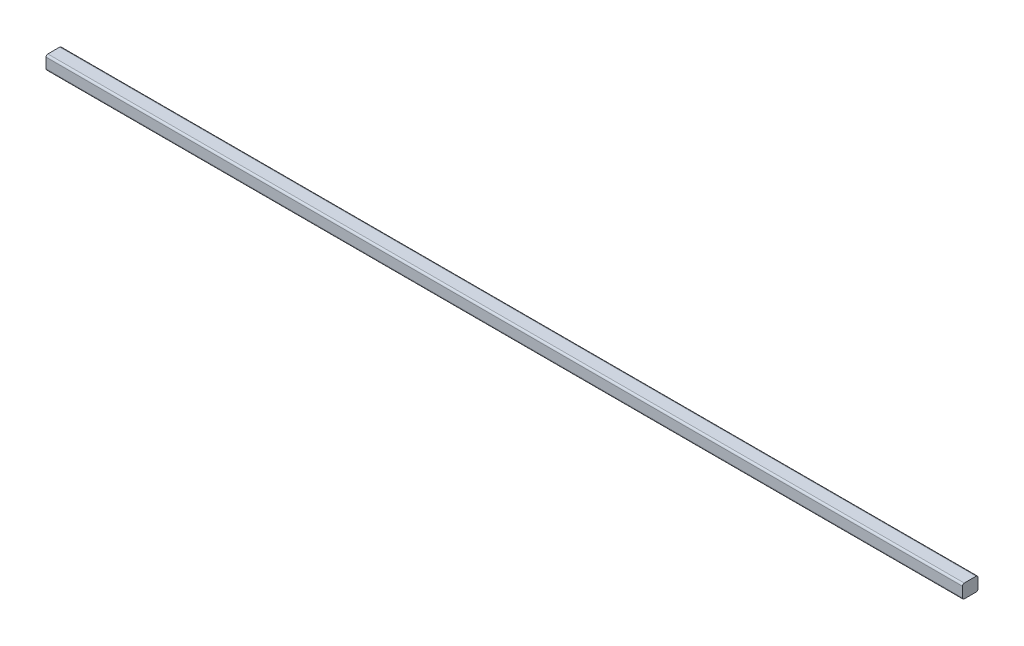
ISO-10303-21;
HEADER;
FILE_DESCRIPTION(('STEP AP214'),'2;1');
FILE_NAME('part.step','',(''),(''),'','','');
FILE_SCHEMA(('AUTOMOTIVE_DESIGN { 1 0 10303 214 1 1 1 1 }'));
ENDSEC;
DATA;
#1=APPLICATION_CONTEXT('core data for automotive mechanical design processes');
#2=APPLICATION_PROTOCOL_DEFINITION('international standard','automotive_design',2000,#1);
#3=PRODUCT_CONTEXT('',#1,'mechanical');
#4=PRODUCT('Part','Part','',(#3));
#5=PRODUCT_RELATED_PRODUCT_CATEGORY('part','',(#4));
#6=PRODUCT_DEFINITION_FORMATION('','',#4);
#7=PRODUCT_DEFINITION_CONTEXT('part definition',#1,'design');
#8=PRODUCT_DEFINITION('design','',#6,#7);
#9=PRODUCT_DEFINITION_SHAPE('','',#8);
#10=(LENGTH_UNIT() NAMED_UNIT(*) SI_UNIT(.MILLI.,.METRE.));
#11=(NAMED_UNIT(*) PLANE_ANGLE_UNIT() SI_UNIT($,.RADIAN.));
#12=(NAMED_UNIT(*) SI_UNIT($,.STERADIAN.) SOLID_ANGLE_UNIT());
#13=UNCERTAINTY_MEASURE_WITH_UNIT(LENGTH_MEASURE(1.E-05),#10,'distance_accuracy_value','');
#14=(GEOMETRIC_REPRESENTATION_CONTEXT(3) GLOBAL_UNCERTAINTY_ASSIGNED_CONTEXT((#13)) GLOBAL_UNIT_ASSIGNED_CONTEXT((#10,
#11,#12)) REPRESENTATION_CONTEXT('',''));
#15=CARTESIAN_POINT('',(0.,0.,0.));
#16=DIRECTION('',(0.,0.,1.));
#17=DIRECTION('',(1.,0.,0.));
#18=AXIS2_PLACEMENT_3D('',#15,#16,#17);
#19=CARTESIAN_POINT('',(500.,-3.75,4.25));
#20=DIRECTION('',(0.,0.,-1.));
#21=DIRECTION('',(-1.,0.,0.));
#22=AXIS2_PLACEMENT_3D('',#19,#20,#21);
#23=PLANE('',#22);
#24=DIRECTION('',(0.,-1.,0.));
#25=VECTOR('',#24,1.);
#26=CARTESIAN_POINT('',(500.,-3.75,4.25));
#27=LINE('',#26,#25);
#28=CARTESIAN_POINT('',(500.,2.75,4.25));
#29=VERTEX_POINT('',#28);
#30=CARTESIAN_POINT('',(500.,-2.75,4.25));
#31=VERTEX_POINT('',#30);
#32=EDGE_CURVE('E141',#29,#31,#27,.T.);
#33=ORIENTED_EDGE('',*,*,#32,.F.);
#34=DIRECTION('',(-1.,0.,0.));
#35=VECTOR('',#34,1.);
#36=CARTESIAN_POINT('',(500.,2.75,4.25));
#37=LINE('',#36,#35);
#38=CARTESIAN_POINT('',(0.,2.75,4.25));
#39=VERTEX_POINT('',#38);
#40=EDGE_CURVE('E11',#29,#39,#37,.T.);
#41=ORIENTED_EDGE('',*,*,#40,.T.);
#42=DIRECTION('',(0.,-1.,0.));
#43=VECTOR('',#42,1.);
#44=CARTESIAN_POINT('',(0.,-3.75,4.25));
#45=LINE('',#44,#43);
#46=CARTESIAN_POINT('',(0.,-2.75,4.25));
#47=VERTEX_POINT('',#46);
#48=EDGE_CURVE('E187',#39,#47,#45,.T.);
#49=ORIENTED_EDGE('',*,*,#48,.T.);
#50=DIRECTION('',(-1.,0.,0.));
#51=VECTOR('',#50,1.);
#52=CARTESIAN_POINT('',(500.,-2.75,4.25));
#53=LINE('',#52,#51);
#54=EDGE_CURVE('E52',#47,#31,#53,.F.);
#55=ORIENTED_EDGE('',*,*,#54,.T.);
#56=EDGE_LOOP('',(#33,#41,#49,#55));
#57=FACE_BOUND('',#56,.T.);
#58=ADVANCED_FACE('F43',(#57),#23,.F.);
#59=CARTESIAN_POINT('',(500.,-3.75,-4.25));
#60=DIRECTION('',(0.,1.,0.));
#61=DIRECTION('',(0.,0.,1.));
#62=AXIS2_PLACEMENT_3D('',#59,#60,#61);
#63=PLANE('',#62);
#64=DIRECTION('',(0.,0.,-1.));
#65=VECTOR('',#64,1.);
#66=CARTESIAN_POINT('',(0.,-3.75,-4.25));
#67=LINE('',#66,#65);
#68=CARTESIAN_POINT('',(0.,-3.75,3.25));
#69=VERTEX_POINT('',#68);
#70=CARTESIAN_POINT('',(0.,-3.75,-3.25));
#71=VERTEX_POINT('',#70);
#72=EDGE_CURVE('E148',#69,#71,#67,.T.);
#73=ORIENTED_EDGE('',*,*,#72,.T.);
#74=DIRECTION('',(-1.,0.,0.));
#75=VECTOR('',#74,1.);
#76=CARTESIAN_POINT('',(500.,-3.75,-3.25));
#77=LINE('',#76,#75);
#78=CARTESIAN_POINT('',(500.,-3.75,-3.25));
#79=VERTEX_POINT('',#78);
#80=EDGE_CURVE('E59',#71,#79,#77,.F.);
#81=ORIENTED_EDGE('',*,*,#80,.T.);
#82=DIRECTION('',(0.,0.,-1.));
#83=VECTOR('',#82,1.);
#84=CARTESIAN_POINT('',(500.,-3.75,-4.25));
#85=LINE('',#84,#83);
#86=CARTESIAN_POINT('',(500.,-3.75,3.25));
#87=VERTEX_POINT('',#86);
#88=EDGE_CURVE('E146',#87,#79,#85,.T.);
#89=ORIENTED_EDGE('',*,*,#88,.F.);
#90=DIRECTION('',(-1.,0.,0.));
#91=VECTOR('',#90,1.);
#92=CARTESIAN_POINT('',(500.,-3.75,3.25));
#93=LINE('',#92,#91);
#94=EDGE_CURVE('E176',#87,#69,#93,.T.);
#95=ORIENTED_EDGE('',*,*,#94,.T.);
#96=EDGE_LOOP('',(#73,#81,#89,#95));
#97=FACE_BOUND('',#96,.T.);
#98=ADVANCED_FACE('F194',(#97),#63,.F.);
#99=CARTESIAN_POINT('',(500.,-3.75,-4.25));
#100=DIRECTION('',(0.,0.,1.));
#101=DIRECTION('',(1.,0.,0.));
#102=AXIS2_PLACEMENT_3D('',#99,#100,#101);
#103=PLANE('',#102);
#104=DIRECTION('',(0.,1.,0.));
#105=VECTOR('',#104,1.);
#106=CARTESIAN_POINT('',(0.,-3.75,-4.25));
#107=LINE('',#106,#105);
#108=CARTESIAN_POINT('',(0.,-2.75,-4.25));
#109=VERTEX_POINT('',#108);
#110=CARTESIAN_POINT('',(0.,2.75,-4.25));
#111=VERTEX_POINT('',#110);
#112=EDGE_CURVE('E142',#109,#111,#107,.T.);
#113=ORIENTED_EDGE('',*,*,#112,.T.);
#114=DIRECTION('',(-1.,0.,0.));
#115=VECTOR('',#114,1.);
#116=CARTESIAN_POINT('',(500.,2.75,-4.25));
#117=LINE('',#116,#115);
#118=CARTESIAN_POINT('',(500.,2.75,-4.25));
#119=VERTEX_POINT('',#118);
#120=EDGE_CURVE('E116',#111,#119,#117,.F.);
#121=ORIENTED_EDGE('',*,*,#120,.T.);
#122=DIRECTION('',(0.,1.,0.));
#123=VECTOR('',#122,1.);
#124=CARTESIAN_POINT('',(500.,-3.75,-4.25));
#125=LINE('',#124,#123);
#126=CARTESIAN_POINT('',(500.,-2.75,-4.25));
#127=VERTEX_POINT('',#126);
#128=EDGE_CURVE('E201',#127,#119,#125,.T.);
#129=ORIENTED_EDGE('',*,*,#128,.F.);
#130=DIRECTION('',(-1.,0.,0.));
#131=VECTOR('',#130,1.);
#132=CARTESIAN_POINT('',(500.,-2.75,-4.25));
#133=LINE('',#132,#131);
#134=EDGE_CURVE('E122',#127,#109,#133,.T.);
#135=ORIENTED_EDGE('',*,*,#134,.T.);
#136=EDGE_LOOP('',(#113,#121,#129,#135));
#137=FACE_BOUND('',#136,.T.);
#138=ADVANCED_FACE('F211',(#137),#103,.F.);
#139=CARTESIAN_POINT('',(500.,3.75,-4.25));
#140=DIRECTION('',(0.,-1.,0.));
#141=DIRECTION('',(0.,0.,-1.));
#142=AXIS2_PLACEMENT_3D('',#139,#140,#141);
#143=PLANE('',#142);
#144=DIRECTION('',(0.,0.,1.));
#145=VECTOR('',#144,1.);
#146=CARTESIAN_POINT('',(500.,3.75,-4.25));
#147=LINE('',#146,#145);
#148=CARTESIAN_POINT('',(500.,3.75,-3.25));
#149=VERTEX_POINT('',#148);
#150=CARTESIAN_POINT('',(500.,3.75,3.25));
#151=VERTEX_POINT('',#150);
#152=EDGE_CURVE('E132',#149,#151,#147,.T.);
#153=ORIENTED_EDGE('',*,*,#152,.F.);
#154=DIRECTION('',(-1.,0.,0.));
#155=VECTOR('',#154,1.);
#156=CARTESIAN_POINT('',(500.,3.75,-3.25));
#157=LINE('',#156,#155);
#158=CARTESIAN_POINT('',(0.,3.75,-3.25));
#159=VERTEX_POINT('',#158);
#160=EDGE_CURVE('E115',#149,#159,#157,.T.);
#161=ORIENTED_EDGE('',*,*,#160,.T.);
#162=DIRECTION('',(0.,0.,1.));
#163=VECTOR('',#162,1.);
#164=CARTESIAN_POINT('',(0.,3.75,-4.25));
#165=LINE('',#164,#163);
#166=CARTESIAN_POINT('',(0.,3.75,3.25));
#167=VERTEX_POINT('',#166);
#168=EDGE_CURVE('E129',#159,#167,#165,.T.);
#169=ORIENTED_EDGE('',*,*,#168,.T.);
#170=DIRECTION('',(-1.,0.,0.));
#171=VECTOR('',#170,1.);
#172=CARTESIAN_POINT('',(500.,3.75,3.25));
#173=LINE('',#172,#171);
#174=EDGE_CURVE('E135',#167,#151,#173,.F.);
#175=ORIENTED_EDGE('',*,*,#174,.T.);
#176=EDGE_LOOP('',(#153,#161,#169,#175));
#177=FACE_BOUND('',#176,.T.);
#178=ADVANCED_FACE('F128',(#177),#143,.F.);
#179=CARTESIAN_POINT('',(500.,0.,0.));
#180=DIRECTION('',(1.,0.,0.));
#181=DIRECTION('',(0.,0.,-1.));
#182=AXIS2_PLACEMENT_3D('',#179,#180,#181);
#183=PLANE('',#182);
#184=ORIENTED_EDGE('',*,*,#128,.T.);
#185=CARTESIAN_POINT('',(500.,2.75,-3.25));
#186=DIRECTION('',(1.,0.,0.));
#187=DIRECTION('',(0.,0.,-1.));
#188=AXIS2_PLACEMENT_3D('',#185,#186,#187);
#189=CIRCLE('',#188,1.);
#190=EDGE_CURVE('E173',#119,#149,#189,.T.);
#191=ORIENTED_EDGE('',*,*,#190,.T.);
#192=ORIENTED_EDGE('',*,*,#152,.T.);
#193=CARTESIAN_POINT('',(500.,2.75,3.25));
#194=DIRECTION('',(1.,0.,0.));
#195=DIRECTION('',(0.,0.,-1.));
#196=AXIS2_PLACEMENT_3D('',#193,#194,#195);
#197=CIRCLE('',#196,1.);
#198=EDGE_CURVE('E167',#151,#29,#197,.T.);
#199=ORIENTED_EDGE('',*,*,#198,.T.);
#200=ORIENTED_EDGE('',*,*,#32,.T.);
#201=CARTESIAN_POINT('',(500.,-2.75,3.25));
#202=DIRECTION('',(1.,0.,0.));
#203=DIRECTION('',(0.,0.,-1.));
#204=AXIS2_PLACEMENT_3D('',#201,#202,#203);
#205=CIRCLE('',#204,1.);
#206=EDGE_CURVE('E66',#31,#87,#205,.T.);
#207=ORIENTED_EDGE('',*,*,#206,.T.);
#208=ORIENTED_EDGE('',*,*,#88,.T.);
#209=CARTESIAN_POINT('',(500.,-2.75,-3.25));
#210=DIRECTION('',(1.,0.,0.));
#211=DIRECTION('',(0.,0.,-1.));
#212=AXIS2_PLACEMENT_3D('',#209,#210,#211);
#213=CIRCLE('',#212,1.);
#214=EDGE_CURVE('E170',#79,#127,#213,.T.);
#215=ORIENTED_EDGE('',*,*,#214,.T.);
#216=EDGE_LOOP('',(#184,#191,#192,#199,#200,#207,#208,#215));
#217=FACE_BOUND('',#216,.T.);
#218=ADVANCED_FACE('F190',(#217),#183,.T.);
#219=CARTESIAN_POINT('',(0.,0.,0.));
#220=DIRECTION('',(1.,0.,0.));
#221=DIRECTION('',(0.,0.,-1.));
#222=AXIS2_PLACEMENT_3D('',#219,#220,#221);
#223=PLANE('',#222);
#224=ORIENTED_EDGE('',*,*,#168,.F.);
#225=CARTESIAN_POINT('',(0.,2.75,-3.25));
#226=DIRECTION('',(1.,0.,0.));
#227=DIRECTION('',(0.,0.,-1.));
#228=AXIS2_PLACEMENT_3D('',#225,#226,#227);
#229=CIRCLE('',#228,1.);
#230=EDGE_CURVE('E111',#159,#111,#229,.F.);
#231=ORIENTED_EDGE('',*,*,#230,.T.);
#232=ORIENTED_EDGE('',*,*,#112,.F.);
#233=CARTESIAN_POINT('',(0.,-2.75,-3.25));
#234=DIRECTION('',(1.,0.,0.));
#235=DIRECTION('',(0.,0.,-1.));
#236=AXIS2_PLACEMENT_3D('',#233,#234,#235);
#237=CIRCLE('',#236,1.);
#238=EDGE_CURVE('E123',#109,#71,#237,.F.);
#239=ORIENTED_EDGE('',*,*,#238,.T.);
#240=ORIENTED_EDGE('',*,*,#72,.F.);
#241=CARTESIAN_POINT('',(0.,-2.75,3.25));
#242=DIRECTION('',(1.,0.,0.));
#243=DIRECTION('',(0.,0.,-1.));
#244=AXIS2_PLACEMENT_3D('',#241,#242,#243);
#245=CIRCLE('',#244,1.);
#246=EDGE_CURVE('E134',#69,#47,#245,.F.);
#247=ORIENTED_EDGE('',*,*,#246,.T.);
#248=ORIENTED_EDGE('',*,*,#48,.F.);
#249=CARTESIAN_POINT('',(0.,2.75,3.25));
#250=DIRECTION('',(1.,0.,0.));
#251=DIRECTION('',(0.,0.,-1.));
#252=AXIS2_PLACEMENT_3D('',#249,#250,#251);
#253=CIRCLE('',#252,1.);
#254=EDGE_CURVE('E139',#39,#167,#253,.F.);
#255=ORIENTED_EDGE('',*,*,#254,.T.);
#256=EDGE_LOOP('',(#224,#231,#232,#239,#240,#247,#248,#255));
#257=FACE_BOUND('',#256,.T.);
#258=ADVANCED_FACE('F137',(#257),#223,.F.);
#259=CARTESIAN_POINT('',(500.,2.75,-3.25));
#260=DIRECTION('',(-1.,0.,0.));
#261=DIRECTION('',(0.,0.,1.));
#262=AXIS2_PLACEMENT_3D('',#259,#260,#261);
#263=CYLINDRICAL_SURFACE('',#262,1.);
#264=ORIENTED_EDGE('',*,*,#190,.F.);
#265=ORIENTED_EDGE('',*,*,#120,.F.);
#266=ORIENTED_EDGE('',*,*,#230,.F.);
#267=ORIENTED_EDGE('',*,*,#160,.F.);
#268=EDGE_LOOP('',(#264,#265,#266,#267));
#269=FACE_BOUND('',#268,.T.);
#270=ADVANCED_FACE('F114',(#269),#263,.T.);
#271=CARTESIAN_POINT('',(500.,-2.75,-3.25));
#272=DIRECTION('',(-1.,0.,0.));
#273=DIRECTION('',(0.,0.,1.));
#274=AXIS2_PLACEMENT_3D('',#271,#272,#273);
#275=CYLINDRICAL_SURFACE('',#274,1.);
#276=ORIENTED_EDGE('',*,*,#214,.F.);
#277=ORIENTED_EDGE('',*,*,#80,.F.);
#278=ORIENTED_EDGE('',*,*,#238,.F.);
#279=ORIENTED_EDGE('',*,*,#134,.F.);
#280=EDGE_LOOP('',(#276,#277,#278,#279));
#281=FACE_BOUND('',#280,.T.);
#282=ADVANCED_FACE('F209',(#281),#275,.T.);
#283=CARTESIAN_POINT('',(500.,2.75,3.25));
#284=DIRECTION('',(-1.,0.,0.));
#285=DIRECTION('',(0.,0.,1.));
#286=AXIS2_PLACEMENT_3D('',#283,#284,#285);
#287=CYLINDRICAL_SURFACE('',#286,1.);
#288=ORIENTED_EDGE('',*,*,#198,.F.);
#289=ORIENTED_EDGE('',*,*,#174,.F.);
#290=ORIENTED_EDGE('',*,*,#254,.F.);
#291=ORIENTED_EDGE('',*,*,#40,.F.);
#292=EDGE_LOOP('',(#288,#289,#290,#291));
#293=FACE_BOUND('',#292,.T.);
#294=ADVANCED_FACE('F213',(#293),#287,.T.);
#295=CARTESIAN_POINT('',(500.,-2.75,3.25));
#296=DIRECTION('',(-1.,0.,0.));
#297=DIRECTION('',(0.,0.,1.));
#298=AXIS2_PLACEMENT_3D('',#295,#296,#297);
#299=CYLINDRICAL_SURFACE('',#298,1.);
#300=ORIENTED_EDGE('',*,*,#206,.F.);
#301=ORIENTED_EDGE('',*,*,#54,.F.);
#302=ORIENTED_EDGE('',*,*,#246,.F.);
#303=ORIENTED_EDGE('',*,*,#94,.F.);
#304=EDGE_LOOP('',(#300,#301,#302,#303));
#305=FACE_BOUND('',#304,.T.);
#306=ADVANCED_FACE('F45',(#305),#299,.T.);
#307=CLOSED_SHELL('',(#58,#98,#138,#178,#218,#258,#270,#282,#294,#306));
#308=MANIFOLD_SOLID_BREP('B2',#307);
#309=ADVANCED_BREP_SHAPE_REPRESENTATION('',(#18,#308),#14);
#310=SHAPE_DEFINITION_REPRESENTATION(#9,#309);
ENDSEC;
END-ISO-10303-21;
